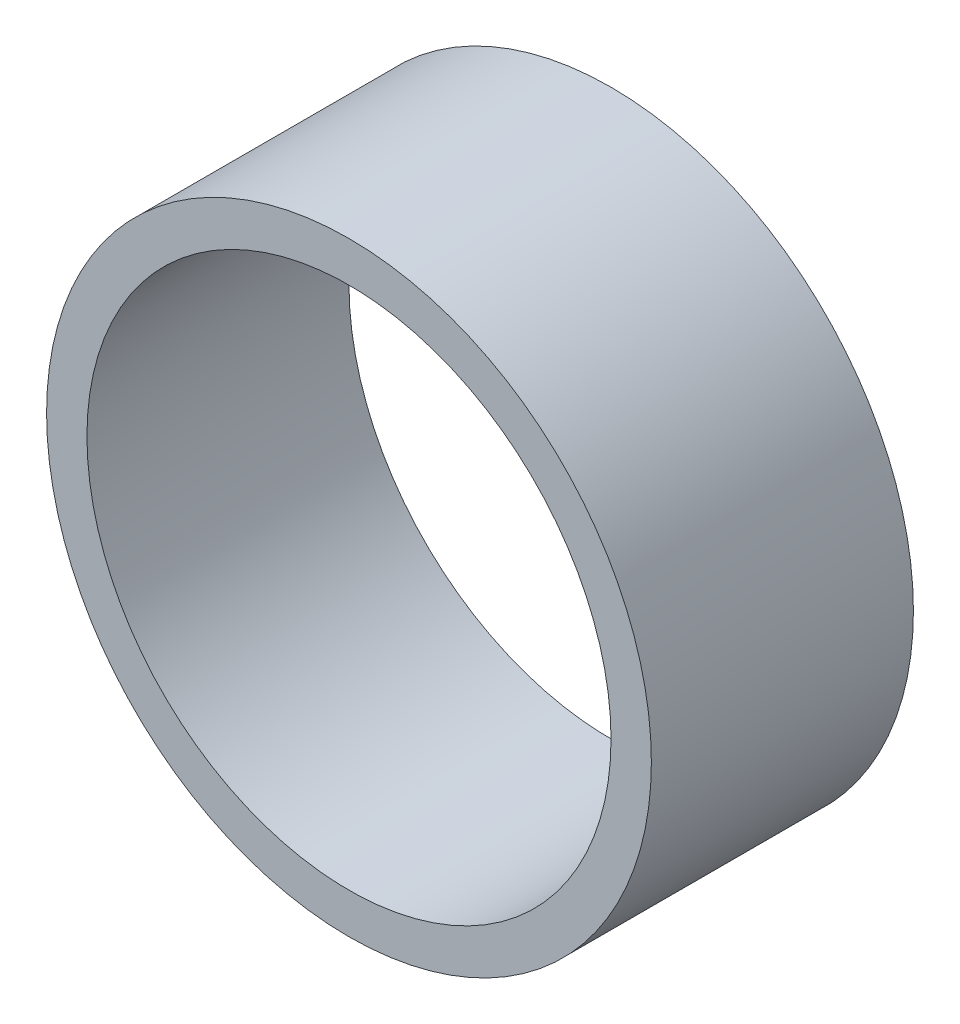
ISO-10303-21;
HEADER;
FILE_DESCRIPTION(('STEP AP214'),'2;1');
FILE_NAME('part.step','',(''),(''),'','','');
FILE_SCHEMA(('AUTOMOTIVE_DESIGN { 1 0 10303 214 1 1 1 1 }'));
ENDSEC;
DATA;
#1=APPLICATION_CONTEXT('core data for automotive mechanical design processes');
#2=APPLICATION_PROTOCOL_DEFINITION('international standard','automotive_design',2000,#1);
#3=PRODUCT_CONTEXT('',#1,'mechanical');
#4=PRODUCT('Part','Part','',(#3));
#5=PRODUCT_RELATED_PRODUCT_CATEGORY('part','',(#4));
#6=PRODUCT_DEFINITION_FORMATION('','',#4);
#7=PRODUCT_DEFINITION_CONTEXT('part definition',#1,'design');
#8=PRODUCT_DEFINITION('design','',#6,#7);
#9=PRODUCT_DEFINITION_SHAPE('','',#8);
#10=(LENGTH_UNIT() NAMED_UNIT(*) SI_UNIT(.MILLI.,.METRE.));
#11=(NAMED_UNIT(*) PLANE_ANGLE_UNIT() SI_UNIT($,.RADIAN.));
#12=(NAMED_UNIT(*) SI_UNIT($,.STERADIAN.) SOLID_ANGLE_UNIT());
#13=UNCERTAINTY_MEASURE_WITH_UNIT(LENGTH_MEASURE(1.E-05),#10,'distance_accuracy_value','');
#14=(GEOMETRIC_REPRESENTATION_CONTEXT(3) GLOBAL_UNCERTAINTY_ASSIGNED_CONTEXT((#13)) GLOBAL_UNIT_ASSIGNED_CONTEXT((#10,
#11,#12)) REPRESENTATION_CONTEXT('',''));
#15=CARTESIAN_POINT('',(0.,0.,0.));
#16=DIRECTION('',(0.,0.,1.));
#17=DIRECTION('',(1.,0.,0.));
#18=AXIS2_PLACEMENT_3D('',#15,#16,#17);
#19=CARTESIAN_POINT('',(0.,0.,10.));
#20=DIRECTION('',(0.,0.,1.));
#21=DIRECTION('',(1.,0.,0.));
#22=AXIS2_PLACEMENT_3D('',#19,#20,#21);
#23=PLANE('',#22);
#24=CARTESIAN_POINT('',(0.,0.,10.));
#25=DIRECTION('',(0.,0.,1.));
#26=DIRECTION('',(1.,0.,0.));
#27=AXIS2_PLACEMENT_3D('',#24,#25,#26);
#28=CIRCLE('',#27,11.54);
#29=CARTESIAN_POINT('',(11.54,0.,10.));
#30=VERTEX_POINT('',#29);
#31=EDGE_CURVE('E10',#30,#30,#28,.T.);
#32=ORIENTED_EDGE('',*,*,#31,.T.);
#33=EDGE_LOOP('',(#32));
#34=FACE_BOUND('',#33,.T.);
#35=CARTESIAN_POINT('',(0.,0.,10.));
#36=DIRECTION('',(0.,0.,1.));
#37=DIRECTION('',(1.,0.,0.));
#38=AXIS2_PLACEMENT_3D('',#35,#36,#37);
#39=CIRCLE('',#38,10.);
#40=CARTESIAN_POINT('',(10.,0.,10.));
#41=VERTEX_POINT('',#40);
#42=EDGE_CURVE('E56',#41,#41,#39,.T.);
#43=ORIENTED_EDGE('',*,*,#42,.F.);
#44=EDGE_LOOP('',(#43));
#45=FACE_BOUND('',#44,.T.);
#46=ADVANCED_FACE('F43',(#34,#45),#23,.T.);
#47=CARTESIAN_POINT('',(0.,0.,0.));
#48=DIRECTION('',(0.,0.,1.));
#49=DIRECTION('',(1.,0.,0.));
#50=AXIS2_PLACEMENT_3D('',#47,#48,#49);
#51=PLANE('',#50);
#52=CARTESIAN_POINT('',(0.,0.,0.));
#53=DIRECTION('',(0.,0.,1.));
#54=DIRECTION('',(1.,0.,0.));
#55=AXIS2_PLACEMENT_3D('',#52,#53,#54);
#56=CIRCLE('',#55,11.54);
#57=CARTESIAN_POINT('',(11.54,0.,0.));
#58=VERTEX_POINT('',#57);
#59=EDGE_CURVE('E47',#58,#58,#56,.T.);
#60=ORIENTED_EDGE('',*,*,#59,.F.);
#61=EDGE_LOOP('',(#60));
#62=FACE_BOUND('',#61,.T.);
#63=CARTESIAN_POINT('',(0.,0.,0.));
#64=DIRECTION('',(0.,0.,1.));
#65=DIRECTION('',(1.,0.,0.));
#66=AXIS2_PLACEMENT_3D('',#63,#64,#65);
#67=CIRCLE('',#66,10.);
#68=CARTESIAN_POINT('',(10.,0.,0.));
#69=VERTEX_POINT('',#68);
#70=EDGE_CURVE('E58',#69,#69,#67,.T.);
#71=ORIENTED_EDGE('',*,*,#70,.T.);
#72=EDGE_LOOP('',(#71));
#73=FACE_BOUND('',#72,.T.);
#74=ADVANCED_FACE('F70',(#62,#73),#51,.F.);
#75=CARTESIAN_POINT('',(0.,0.,10.));
#76=DIRECTION('',(0.,0.,-1.));
#77=DIRECTION('',(-1.,0.,0.));
#78=AXIS2_PLACEMENT_3D('',#75,#76,#77);
#79=CYLINDRICAL_SURFACE('',#78,11.54);
#80=ORIENTED_EDGE('',*,*,#31,.F.);
#81=EDGE_LOOP('',(#80));
#82=FACE_BOUND('',#81,.T.);
#83=ORIENTED_EDGE('',*,*,#59,.T.);
#84=EDGE_LOOP('',(#83));
#85=FACE_BOUND('',#84,.T.);
#86=ADVANCED_FACE('F45',(#82,#85),#79,.T.);
#87=CARTESIAN_POINT('',(0.,0.,10.));
#88=DIRECTION('',(0.,0.,-1.));
#89=DIRECTION('',(-1.,0.,0.));
#90=AXIS2_PLACEMENT_3D('',#87,#88,#89);
#91=CYLINDRICAL_SURFACE('',#90,10.);
#92=ORIENTED_EDGE('',*,*,#42,.T.);
#93=EDGE_LOOP('',(#92));
#94=FACE_BOUND('',#93,.T.);
#95=ORIENTED_EDGE('',*,*,#70,.F.);
#96=EDGE_LOOP('',(#95));
#97=FACE_BOUND('',#96,.T.);
#98=ADVANCED_FACE('F66',(#94,#97),#91,.F.);
#99=CLOSED_SHELL('',(#46,#74,#86,#98));
#100=MANIFOLD_SOLID_BREP('B2',#99);
#101=ADVANCED_BREP_SHAPE_REPRESENTATION('',(#18,#100),#14);
#102=SHAPE_DEFINITION_REPRESENTATION(#9,#101);
ENDSEC;
END-ISO-10303-21;
